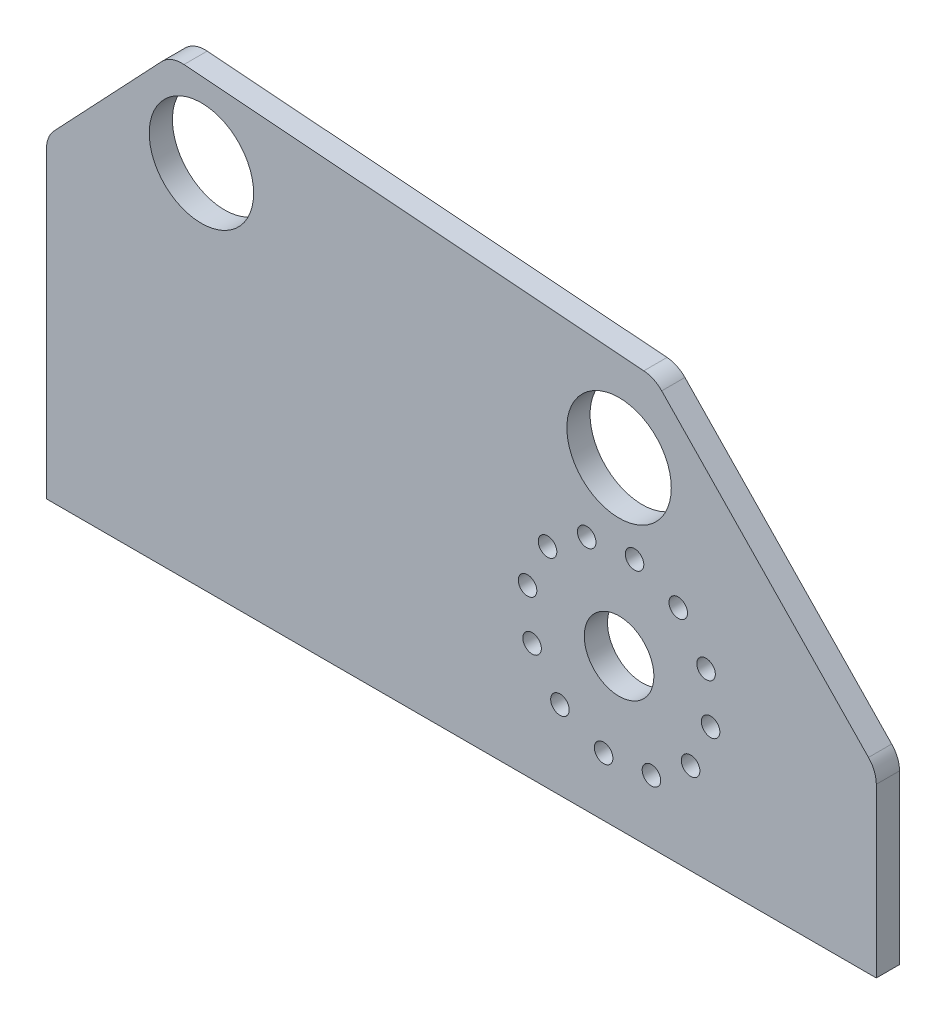
ISO-10303-21;
HEADER;
FILE_DESCRIPTION(('STEP AP214'),'2;1');
FILE_NAME('part.step','',(''),(''),'','','');
FILE_SCHEMA(('AUTOMOTIVE_DESIGN { 1 0 10303 214 1 1 1 1 }'));
ENDSEC;
DATA;
#1=APPLICATION_CONTEXT('core data for automotive mechanical design processes');
#2=APPLICATION_PROTOCOL_DEFINITION('international standard','automotive_design',2000,#1);
#3=PRODUCT_CONTEXT('',#1,'mechanical');
#4=PRODUCT('Part','Part','',(#3));
#5=PRODUCT_RELATED_PRODUCT_CATEGORY('part','',(#4));
#6=PRODUCT_DEFINITION_FORMATION('','',#4);
#7=PRODUCT_DEFINITION_CONTEXT('part definition',#1,'design');
#8=PRODUCT_DEFINITION('design','',#6,#7);
#9=PRODUCT_DEFINITION_SHAPE('','',#8);
#10=(LENGTH_UNIT() NAMED_UNIT(*) SI_UNIT(.MILLI.,.METRE.));
#11=(NAMED_UNIT(*) PLANE_ANGLE_UNIT() SI_UNIT($,.RADIAN.));
#12=(NAMED_UNIT(*) SI_UNIT($,.STERADIAN.) SOLID_ANGLE_UNIT());
#13=UNCERTAINTY_MEASURE_WITH_UNIT(LENGTH_MEASURE(1.E-05),#10,'distance_accuracy_value','');
#14=(GEOMETRIC_REPRESENTATION_CONTEXT(3) GLOBAL_UNCERTAINTY_ASSIGNED_CONTEXT((#13)) GLOBAL_UNIT_ASSIGNED_CONTEXT((#10,
#11,#12)) REPRESENTATION_CONTEXT('',''));
#15=CARTESIAN_POINT('',(0.,0.,0.));
#16=DIRECTION('',(0.,0.,1.));
#17=DIRECTION('',(1.,0.,0.));
#18=AXIS2_PLACEMENT_3D('',#15,#16,#17);
#19=CARTESIAN_POINT('',(-56.6052196507486,0.,3.175));
#20=DIRECTION('',(1.,0.,0.));
#21=DIRECTION('',(0.,0.,-1.));
#22=AXIS2_PLACEMENT_3D('',#19,#20,#21);
#23=PLANE('',#22);
#24=DIRECTION('',(0.,-1.,0.));
#25=VECTOR('',#24,1.);
#26=CARTESIAN_POINT('',(-56.6052196507486,0.,-3.175));
#27=LINE('',#26,#25);
#28=CARTESIAN_POINT('',(-56.6052196507486,200.39998243696,-3.175));
#29=VERTEX_POINT('',#28);
#30=CARTESIAN_POINT('',(-56.6052196507486,154.488890978673,-3.175));
#31=VERTEX_POINT('',#30);
#32=EDGE_CURVE('E220',#29,#31,#27,.T.);
#33=ORIENTED_EDGE('',*,*,#32,.F.);
#34=DIRECTION('',(0.,0.,-1.));
#35=VECTOR('',#34,1.);
#36=CARTESIAN_POINT('',(-56.6052196507486,200.39998243696,3.175));
#37=LINE('',#36,#35);
#38=CARTESIAN_POINT('',(-56.6052196507486,200.39998243696,3.175));
#39=VERTEX_POINT('',#38);
#40=EDGE_CURVE('E11',#39,#29,#37,.T.);
#41=ORIENTED_EDGE('',*,*,#40,.F.);
#42=DIRECTION('',(0.,-1.,0.));
#43=VECTOR('',#42,1.);
#44=CARTESIAN_POINT('',(-56.6052196507486,0.,3.175));
#45=LINE('',#44,#43);
#46=CARTESIAN_POINT('',(-56.6052196507486,154.488890978673,3.175));
#47=VERTEX_POINT('',#46);
#48=EDGE_CURVE('E304',#39,#47,#45,.T.);
#49=ORIENTED_EDGE('',*,*,#48,.T.);
#50=DIRECTION('',(0.,0.,-1.));
#51=VECTOR('',#50,1.);
#52=CARTESIAN_POINT('',(-56.6052196507486,154.488890978673,3.175));
#53=LINE('',#52,#51);
#54=EDGE_CURVE('E67',#47,#31,#53,.T.);
#55=ORIENTED_EDGE('',*,*,#54,.T.);
#56=EDGE_LOOP('',(#33,#41,#49,#55));
#57=FACE_BOUND('',#56,.T.);
#58=ADVANCED_FACE('F49',(#57),#23,.T.);
#59=CARTESIAN_POINT('',(-64.2252196507486,200.39998243696,3.175));
#60=DIRECTION('',(0.,0.,-1.));
#61=DIRECTION('',(-1.,0.,0.));
#62=AXIS2_PLACEMENT_3D('',#59,#60,#61);
#63=CYLINDRICAL_SURFACE('',#62,7.62000000000002);
#64=CARTESIAN_POINT('',(-64.2252196507486,200.39998243696,-3.175));
#65=DIRECTION('',(0.,0.,1.));
#66=DIRECTION('',(1.,0.,0.));
#67=AXIS2_PLACEMENT_3D('',#64,#65,#66);
#68=CIRCLE('',#67,7.62000000000002);
#69=CARTESIAN_POINT('',(-58.7443216503223,205.6937671992,-3.175));
#70=VERTEX_POINT('',#69);
#71=EDGE_CURVE('E223',#29,#70,#68,.T.);
#72=ORIENTED_EDGE('',*,*,#71,.T.);
#73=DIRECTION('',(0.,0.,-1.));
#74=VECTOR('',#73,1.);
#75=CARTESIAN_POINT('',(-58.7443216503223,205.6937671992,3.175));
#76=LINE('',#75,#74);
#77=CARTESIAN_POINT('',(-58.7443216503223,205.6937671992,3.175));
#78=VERTEX_POINT('',#77);
#79=EDGE_CURVE('E59',#78,#70,#76,.T.);
#80=ORIENTED_EDGE('',*,*,#79,.F.);
#81=CARTESIAN_POINT('',(-64.2252196507486,200.39998243696,3.175));
#82=DIRECTION('',(0.,0.,1.));
#83=DIRECTION('',(1.,0.,0.));
#84=AXIS2_PLACEMENT_3D('',#81,#82,#83);
#85=CIRCLE('',#84,7.62000000000002);
#86=EDGE_CURVE('E300',#39,#78,#85,.T.);
#87=ORIENTED_EDGE('',*,*,#86,.F.);
#88=ORIENTED_EDGE('',*,*,#40,.T.);
#89=EDGE_LOOP('',(#72,#80,#87,#88));
#90=FACE_BOUND('',#89,.T.);
#91=ADVANCED_FACE('F284',(#90),#63,.T.);
#92=CARTESIAN_POINT('',(72.3928618493464,69.9214305617787,3.175));
#93=DIRECTION('',(0.719277952811856,0.694722409742759,0.));
#94=DIRECTION('',(-0.694722409742759,0.719277952811856,0.));
#95=AXIS2_PLACEMENT_3D('',#92,#93,#94);
#96=PLANE('',#95);
#97=DIRECTION('',(0.694722409742759,-0.719277952811856,0.));
#98=VECTOR('',#97,1.);
#99=CARTESIAN_POINT('',(72.3928618493464,69.9214305617787,-3.175));
#100=LINE('',#99,#98);
#101=CARTESIAN_POINT('',(-115.329485400629,264.27898076229,-3.175));
#102=VERTEX_POINT('',#101);
#103=EDGE_CURVE('E227',#102,#70,#100,.T.);
#104=ORIENTED_EDGE('',*,*,#103,.F.);
#105=DIRECTION('',(0.,0.,-1.));
#106=VECTOR('',#105,1.);
#107=CARTESIAN_POINT('',(-115.329485400629,264.27898076229,3.175));
#108=LINE('',#107,#106);
#109=CARTESIAN_POINT('',(-115.329485400629,264.27898076229,3.175));
#110=VERTEX_POINT('',#109);
#111=EDGE_CURVE('E272',#110,#102,#108,.T.);
#112=ORIENTED_EDGE('',*,*,#111,.F.);
#113=DIRECTION('',(0.694722409742759,-0.719277952811856,0.));
#114=VECTOR('',#113,1.);
#115=CARTESIAN_POINT('',(72.3928618493464,69.9214305617787,3.175));
#116=LINE('',#115,#114);
#117=EDGE_CURVE('E281',#110,#78,#116,.T.);
#118=ORIENTED_EDGE('',*,*,#117,.T.);
#119=ORIENTED_EDGE('',*,*,#79,.T.);
#120=EDGE_LOOP('',(#104,#112,#118,#119));
#121=FACE_BOUND('',#120,.T.);
#122=ADVANCED_FACE('F279',(#121),#96,.T.);
#123=CARTESIAN_POINT('',(-120.810383401055,258.985196000051,3.175));
#124=DIRECTION('',(0.,0.,-1.));
#125=DIRECTION('',(-1.,0.,0.));
#126=AXIS2_PLACEMENT_3D('',#123,#124,#125);
#127=CYLINDRICAL_SURFACE('',#126,7.61999999999996);
#128=CARTESIAN_POINT('',(-120.810383401055,258.985196000051,-3.175));
#129=DIRECTION('',(0.,0.,1.));
#130=DIRECTION('',(1.,0.,0.));
#131=AXIS2_PLACEMENT_3D('',#128,#129,#130);
#132=CIRCLE('',#131,7.61999999999996);
#133=CARTESIAN_POINT('',(-120.226343784635,266.58278099309,-3.175));
#134=VERTEX_POINT('',#133);
#135=EDGE_CURVE('E231',#102,#134,#132,.T.);
#136=ORIENTED_EDGE('',*,*,#135,.T.);
#137=DIRECTION('',(0.,0.,-1.));
#138=VECTOR('',#137,1.);
#139=CARTESIAN_POINT('',(-120.226343784635,266.58278099309,3.175));
#140=LINE('',#139,#138);
#141=CARTESIAN_POINT('',(-120.226343784635,266.58278099309,3.175));
#142=VERTEX_POINT('',#141);
#143=EDGE_CURVE('E269',#142,#134,#140,.T.);
#144=ORIENTED_EDGE('',*,*,#143,.F.);
#145=CARTESIAN_POINT('',(-120.810383401055,258.985196000051,3.175));
#146=DIRECTION('',(0.,0.,1.));
#147=DIRECTION('',(1.,0.,0.));
#148=AXIS2_PLACEMENT_3D('',#145,#146,#147);
#149=CIRCLE('',#148,7.61999999999996);
#150=EDGE_CURVE('E295',#110,#142,#149,.T.);
#151=ORIENTED_EDGE('',*,*,#150,.F.);
#152=ORIENTED_EDGE('',*,*,#111,.T.);
#153=EDGE_LOOP('',(#136,#144,#151,#152));
#154=FACE_BOUND('',#153,.T.);
#155=ADVANCED_FACE('F292',(#154),#127,.T.);
#156=CARTESIAN_POINT('',(19.6660224801687,255.829010682081,3.175));
#157=DIRECTION('',(0.0766456189528719,0.99705839803661,0.));
#158=DIRECTION('',(-0.99705839803661,0.0766456189528719,0.));
#159=AXIS2_PLACEMENT_3D('',#156,#157,#158);
#160=PLANE('',#159);
#161=DIRECTION('',(0.99705839803661,-0.0766456189528719,0.));
#162=VECTOR('',#161,1.);
#163=CARTESIAN_POINT('',(19.6660224801687,255.829010682081,-3.175));
#164=LINE('',#163,#162);
#165=CARTESIAN_POINT('',(-246.064861075341,276.256207409085,-3.175));
#166=VERTEX_POINT('',#165);
#167=EDGE_CURVE('E235',#166,#134,#164,.T.);
#168=ORIENTED_EDGE('',*,*,#167,.F.);
#169=DIRECTION('',(0.,0.,-1.));
#170=VECTOR('',#169,1.);
#171=CARTESIAN_POINT('',(-246.064861075341,276.256207409085,3.175));
#172=LINE('',#171,#170);
#173=CARTESIAN_POINT('',(-246.064861075341,276.256207409085,3.175));
#174=VERTEX_POINT('',#173);
#175=EDGE_CURVE('E266',#174,#166,#172,.T.);
#176=ORIENTED_EDGE('',*,*,#175,.F.);
#177=DIRECTION('',(0.99705839803661,-0.0766456189528719,0.));
#178=VECTOR('',#177,1.);
#179=CARTESIAN_POINT('',(19.6660224801687,255.829010682081,3.175));
#180=LINE('',#179,#178);
#181=EDGE_CURVE('E298',#174,#142,#180,.T.);
#182=ORIENTED_EDGE('',*,*,#181,.T.);
#183=ORIENTED_EDGE('',*,*,#143,.T.);
#184=EDGE_LOOP('',(#168,#176,#182,#183));
#185=FACE_BOUND('',#184,.T.);
#186=ADVANCED_FACE('F599',(#185),#160,.T.);
#187=CARTESIAN_POINT('',(-246.648900691762,268.658622416047,3.175));
#188=DIRECTION('',(0.,0.,-1.));
#189=DIRECTION('',(-1.,0.,0.));
#190=AXIS2_PLACEMENT_3D('',#187,#188,#189);
#191=CYLINDRICAL_SURFACE('',#190,7.61999999999996);
#192=CARTESIAN_POINT('',(-246.648900691762,268.658622416047,-3.175));
#193=DIRECTION('',(0.,0.,1.));
#194=DIRECTION('',(1.,0.,0.));
#195=AXIS2_PLACEMENT_3D('',#192,#193,#194);
#196=CIRCLE('',#195,7.61999999999996);
#197=CARTESIAN_POINT('',(-252.186796021744,273.892752268674,-3.175));
#198=VERTEX_POINT('',#197);
#199=EDGE_CURVE('E239',#166,#198,#196,.T.);
#200=ORIENTED_EDGE('',*,*,#199,.T.);
#201=DIRECTION('',(0.,0.,-1.));
#202=VECTOR('',#201,1.);
#203=CARTESIAN_POINT('',(-252.186796021744,273.892752268674,3.175));
#204=LINE('',#203,#202);
#205=CARTESIAN_POINT('',(-252.186796021744,273.892752268674,3.175));
#206=VERTEX_POINT('',#205);
#207=EDGE_CURVE('E263',#206,#198,#204,.T.);
#208=ORIENTED_EDGE('',*,*,#207,.F.);
#209=CARTESIAN_POINT('',(-246.648900691762,268.658622416047,3.175));
#210=DIRECTION('',(0.,0.,1.));
#211=DIRECTION('',(1.,0.,0.));
#212=AXIS2_PLACEMENT_3D('',#209,#210,#211);
#213=CIRCLE('',#212,7.61999999999996);
#214=EDGE_CURVE('E310',#174,#206,#213,.T.);
#215=ORIENTED_EDGE('',*,*,#214,.F.);
#216=ORIENTED_EDGE('',*,*,#175,.T.);
#217=EDGE_LOOP('',(#200,#208,#215,#216));
#218=FACE_BOUND('',#217,.T.);
#219=ADVANCED_FACE('F591',(#218),#191,.T.);
#220=CARTESIAN_POINT('',(-269.928029914058,255.121896541613,3.175));
#221=DIRECTION('',(-0.72675791732049,0.686893681447124,0.));
#222=DIRECTION('',(-0.686893681447124,-0.72675791732049,0.));
#223=AXIS2_PLACEMENT_3D('',#220,#221,#222);
#224=PLANE('',#223);
#225=DIRECTION('',(0.686893681447124,0.72675791732049,0.));
#226=VECTOR('',#225,1.);
#227=CARTESIAN_POINT('',(-269.928029914058,255.121896541613,-3.175));
#228=LINE('',#227,#226);
#229=CARTESIAN_POINT('',(-281.613376670001,242.758384544203,-3.175));
#230=VERTEX_POINT('',#229);
#231=EDGE_CURVE('E243',#230,#198,#228,.T.);
#232=ORIENTED_EDGE('',*,*,#231,.F.);
#233=DIRECTION('',(0.,0.,-1.));
#234=VECTOR('',#233,1.);
#235=CARTESIAN_POINT('',(-281.613376670001,242.758384544203,3.175));
#236=LINE('',#235,#234);
#237=CARTESIAN_POINT('',(-281.613376670001,242.758384544203,3.175));
#238=VERTEX_POINT('',#237);
#239=EDGE_CURVE('E150',#238,#230,#236,.T.);
#240=ORIENTED_EDGE('',*,*,#239,.F.);
#241=DIRECTION('',(0.686893681447124,0.72675791732049,0.));
#242=VECTOR('',#241,1.);
#243=CARTESIAN_POINT('',(-269.928029914058,255.121896541613,3.175));
#244=LINE('',#243,#242);
#245=EDGE_CURVE('E138',#238,#206,#244,.T.);
#246=ORIENTED_EDGE('',*,*,#245,.T.);
#247=ORIENTED_EDGE('',*,*,#207,.T.);
#248=EDGE_LOOP('',(#232,#240,#246,#247));
#249=FACE_BOUND('',#248,.T.);
#250=ADVANCED_FACE('F315',(#249),#224,.T.);
#251=CARTESIAN_POINT('',(-276.075481340018,237.524254691576,3.175));
#252=DIRECTION('',(0.,0.,-1.));
#253=DIRECTION('',(-1.,0.,0.));
#254=AXIS2_PLACEMENT_3D('',#251,#252,#253);
#255=CYLINDRICAL_SURFACE('',#254,7.62);
#256=CARTESIAN_POINT('',(-276.075481340018,237.524254691576,-3.175));
#257=DIRECTION('',(0.,0.,1.));
#258=DIRECTION('',(1.,0.,0.));
#259=AXIS2_PLACEMENT_3D('',#256,#257,#258);
#260=CIRCLE('',#259,7.62);
#261=CARTESIAN_POINT('',(-283.695481340018,237.524254691576,-3.175));
#262=VERTEX_POINT('',#261);
#263=EDGE_CURVE('E146',#230,#262,#260,.T.);
#264=ORIENTED_EDGE('',*,*,#263,.T.);
#265=DIRECTION('',(0.,0.,-1.));
#266=VECTOR('',#265,1.);
#267=CARTESIAN_POINT('',(-283.695481340018,237.524254691576,3.175));
#268=LINE('',#267,#266);
#269=CARTESIAN_POINT('',(-283.695481340018,237.524254691576,3.175));
#270=VERTEX_POINT('',#269);
#271=EDGE_CURVE('E143',#270,#262,#268,.T.);
#272=ORIENTED_EDGE('',*,*,#271,.F.);
#273=CARTESIAN_POINT('',(-276.075481340018,237.524254691576,3.175));
#274=DIRECTION('',(0.,0.,1.));
#275=DIRECTION('',(1.,0.,0.));
#276=AXIS2_PLACEMENT_3D('',#273,#274,#275);
#277=CIRCLE('',#276,7.62);
#278=EDGE_CURVE('E130',#238,#270,#277,.T.);
#279=ORIENTED_EDGE('',*,*,#278,.F.);
#280=ORIENTED_EDGE('',*,*,#239,.T.);
#281=EDGE_LOOP('',(#264,#272,#279,#280));
#282=FACE_BOUND('',#281,.T.);
#283=ADVANCED_FACE('F144',(#282),#255,.T.);
#284=CARTESIAN_POINT('',(-283.695481340018,0.,3.175));
#285=DIRECTION('',(-1.,0.,0.));
#286=DIRECTION('',(0.,0.,1.));
#287=AXIS2_PLACEMENT_3D('',#284,#285,#286);
#288=PLANE('',#287);
#289=DIRECTION('',(0.,1.,0.));
#290=VECTOR('',#289,1.);
#291=CARTESIAN_POINT('',(-283.695481340018,0.,-3.175));
#292=LINE('',#291,#290);
#293=CARTESIAN_POINT('',(-283.695481340018,154.488890978673,-3.175));
#294=VERTEX_POINT('',#293);
#295=EDGE_CURVE('E249',#294,#262,#292,.T.);
#296=ORIENTED_EDGE('',*,*,#295,.F.);
#297=DIRECTION('',(0.,0.,-1.));
#298=VECTOR('',#297,1.);
#299=CARTESIAN_POINT('',(-283.695481340018,154.488890978673,3.175));
#300=LINE('',#299,#298);
#301=CARTESIAN_POINT('',(-283.695481340018,154.488890978673,3.175));
#302=VERTEX_POINT('',#301);
#303=EDGE_CURVE('E98',#302,#294,#300,.T.);
#304=ORIENTED_EDGE('',*,*,#303,.F.);
#305=DIRECTION('',(0.,1.,0.));
#306=VECTOR('',#305,1.);
#307=CARTESIAN_POINT('',(-283.695481340018,0.,3.175));
#308=LINE('',#307,#306);
#309=EDGE_CURVE('E136',#302,#270,#308,.T.);
#310=ORIENTED_EDGE('',*,*,#309,.T.);
#311=ORIENTED_EDGE('',*,*,#271,.T.);
#312=EDGE_LOOP('',(#296,#304,#310,#311));
#313=FACE_BOUND('',#312,.T.);
#314=ADVANCED_FACE('F152',(#313),#288,.T.);
#315=CARTESIAN_POINT('',(-127.,242.57,3.175));
#316=DIRECTION('',(0.,0.,-1.));
#317=DIRECTION('',(-1.,0.,0.));
#318=AXIS2_PLACEMENT_3D('',#315,#316,#317);
#319=CYLINDRICAL_SURFACE('',#318,14.2875);
#320=CARTESIAN_POINT('',(-127.,242.57,3.175));
#321=DIRECTION('',(0.,0.,1.));
#322=DIRECTION('',(1.,0.,0.));
#323=AXIS2_PLACEMENT_3D('',#320,#321,#322);
#324=CIRCLE('',#323,14.2875);
#325=CARTESIAN_POINT('',(-112.7125,242.57,3.175));
#326=VERTEX_POINT('',#325);
#327=EDGE_CURVE('E736',#326,#326,#324,.T.);
#328=ORIENTED_EDGE('',*,*,#327,.T.);
#329=EDGE_LOOP('',(#328));
#330=FACE_BOUND('',#329,.T.);
#331=CARTESIAN_POINT('',(-127.,242.57,-3.175));
#332=DIRECTION('',(0.,0.,1.));
#333=DIRECTION('',(1.,0.,0.));
#334=AXIS2_PLACEMENT_3D('',#331,#332,#333);
#335=CIRCLE('',#334,14.2875);
#336=CARTESIAN_POINT('',(-112.7125,242.57,-3.175));
#337=VERTEX_POINT('',#336);
#338=EDGE_CURVE('E216',#337,#337,#335,.T.);
#339=ORIENTED_EDGE('',*,*,#338,.F.);
#340=EDGE_LOOP('',(#339));
#341=FACE_BOUND('',#340,.T.);
#342=ADVANCED_FACE('F338',(#330,#341),#319,.F.);
#343=CARTESIAN_POINT('',(-241.3,255.27,3.175));
#344=DIRECTION('',(0.,0.,-1.));
#345=DIRECTION('',(-1.,0.,0.));
#346=AXIS2_PLACEMENT_3D('',#343,#344,#345);
#347=CYLINDRICAL_SURFACE('',#346,14.2875);
#348=CARTESIAN_POINT('',(-241.3,255.27,3.175));
#349=DIRECTION('',(0.,0.,1.));
#350=DIRECTION('',(1.,0.,0.));
#351=AXIS2_PLACEMENT_3D('',#348,#349,#350);
#352=CIRCLE('',#351,14.2875);
#353=CARTESIAN_POINT('',(-227.0125,255.27,3.175));
#354=VERTEX_POINT('',#353);
#355=EDGE_CURVE('E732',#354,#354,#352,.T.);
#356=ORIENTED_EDGE('',*,*,#355,.T.);
#357=EDGE_LOOP('',(#356));
#358=FACE_BOUND('',#357,.T.);
#359=CARTESIAN_POINT('',(-241.3,255.27,-3.175));
#360=DIRECTION('',(0.,0.,1.));
#361=DIRECTION('',(1.,0.,0.));
#362=AXIS2_PLACEMENT_3D('',#359,#360,#361);
#363=CIRCLE('',#362,14.2875);
#364=CARTESIAN_POINT('',(-227.0125,255.27,-3.175));
#365=VERTEX_POINT('',#364);
#366=EDGE_CURVE('E212',#365,#365,#363,.T.);
#367=ORIENTED_EDGE('',*,*,#366,.F.);
#368=EDGE_LOOP('',(#367));
#369=FACE_BOUND('',#368,.T.);
#370=ADVANCED_FACE('F341',(#358,#369),#347,.F.);
#371=CARTESIAN_POINT('',(-135.860813465871,219.384327016806,3.175));
#372=DIRECTION('',(0.,0.,-1.));
#373=DIRECTION('',(-1.,0.,0.));
#374=AXIS2_PLACEMENT_3D('',#371,#372,#373);
#375=CYLINDRICAL_SURFACE('',#374,2.54000000000004);
#376=CARTESIAN_POINT('',(-135.860813465871,219.384327016806,3.175));
#377=DIRECTION('',(0.,0.,1.));
#378=DIRECTION('',(1.,0.,0.));
#379=AXIS2_PLACEMENT_3D('',#376,#377,#378);
#380=CIRCLE('',#379,2.54000000000004);
#381=CARTESIAN_POINT('',(-133.320813465871,219.384327016806,3.175));
#382=VERTEX_POINT('',#381);
#383=EDGE_CURVE('E728',#382,#382,#380,.T.);
#384=ORIENTED_EDGE('',*,*,#383,.T.);
#385=EDGE_LOOP('',(#384));
#386=FACE_BOUND('',#385,.T.);
#387=CARTESIAN_POINT('',(-135.860813465871,219.384327016806,-3.175));
#388=DIRECTION('',(0.,0.,1.));
#389=DIRECTION('',(1.,0.,0.));
#390=AXIS2_PLACEMENT_3D('',#387,#388,#389);
#391=CIRCLE('',#390,2.54000000000004);
#392=CARTESIAN_POINT('',(-133.320813465871,219.384327016806,-3.175));
#393=VERTEX_POINT('',#392);
#394=EDGE_CURVE('E208',#393,#393,#391,.T.);
#395=ORIENTED_EDGE('',*,*,#394,.F.);
#396=EDGE_LOOP('',(#395));
#397=FACE_BOUND('',#396,.T.);
#398=ADVANCED_FACE('F345',(#386,#397),#375,.F.);
#399=CARTESIAN_POINT('',(-146.575853068043,211.764745183611,3.175));
#400=DIRECTION('',(0.,0.,-1.));
#401=DIRECTION('',(-1.,0.,0.));
#402=AXIS2_PLACEMENT_3D('',#399,#400,#401);
#403=CYLINDRICAL_SURFACE('',#402,2.54000000000004);
#404=CARTESIAN_POINT('',(-146.575853068043,211.764745183611,3.175));
#405=DIRECTION('',(0.,0.,1.));
#406=DIRECTION('',(1.,0.,0.));
#407=AXIS2_PLACEMENT_3D('',#404,#405,#406);
#408=CIRCLE('',#407,2.54000000000004);
#409=CARTESIAN_POINT('',(-144.035853068043,211.764745183611,3.175));
#410=VERTEX_POINT('',#409);
#411=EDGE_CURVE('E724',#410,#410,#408,.T.);
#412=ORIENTED_EDGE('',*,*,#411,.T.);
#413=EDGE_LOOP('',(#412));
#414=FACE_BOUND('',#413,.T.);
#415=CARTESIAN_POINT('',(-146.575853068043,211.764745183611,-3.175));
#416=DIRECTION('',(0.,0.,1.));
#417=DIRECTION('',(1.,0.,0.));
#418=AXIS2_PLACEMENT_3D('',#415,#416,#417);
#419=CIRCLE('',#418,2.54000000000004);
#420=CARTESIAN_POINT('',(-144.035853068043,211.764745183611,-3.175));
#421=VERTEX_POINT('',#420);
#422=EDGE_CURVE('E204',#421,#421,#419,.T.);
#423=ORIENTED_EDGE('',*,*,#422,.F.);
#424=EDGE_LOOP('',(#423));
#425=FACE_BOUND('',#424,.T.);
#426=ADVANCED_FACE('F349',(#414,#425),#403,.F.);
#427=CARTESIAN_POINT('',(-152.045558649482,199.808473948763,3.175));
#428=DIRECTION('',(0.,0.,-1.));
#429=DIRECTION('',(-1.,0.,0.));
#430=AXIS2_PLACEMENT_3D('',#427,#428,#429);
#431=CYLINDRICAL_SURFACE('',#430,2.54000000000001);
#432=CARTESIAN_POINT('',(-152.045558649482,199.808473948763,3.175));
#433=DIRECTION('',(0.,0.,1.));
#434=DIRECTION('',(1.,0.,0.));
#435=AXIS2_PLACEMENT_3D('',#432,#433,#434);
#436=CIRCLE('',#435,2.54000000000001);
#437=CARTESIAN_POINT('',(-149.505558649482,199.808473948763,3.175));
#438=VERTEX_POINT('',#437);
#439=EDGE_CURVE('E720',#438,#438,#436,.T.);
#440=ORIENTED_EDGE('',*,*,#439,.T.);
#441=EDGE_LOOP('',(#440));
#442=FACE_BOUND('',#441,.T.);
#443=CARTESIAN_POINT('',(-152.045558649482,199.808473948763,-3.175));
#444=DIRECTION('',(0.,0.,1.));
#445=DIRECTION('',(1.,0.,0.));
#446=AXIS2_PLACEMENT_3D('',#443,#444,#445);
#447=CIRCLE('',#446,2.54000000000001);
#448=CARTESIAN_POINT('',(-149.505558649482,199.808473948763,-3.175));
#449=VERTEX_POINT('',#448);
#450=EDGE_CURVE('E200',#449,#449,#447,.T.);
#451=ORIENTED_EDGE('',*,*,#450,.F.);
#452=EDGE_LOOP('',(#451));
#453=FACE_BOUND('',#452,.T.);
#454=ADVANCED_FACE('F353',(#442,#453),#431,.F.);
#455=CARTESIAN_POINT('',(-150.804327016806,186.719186534129,3.175));
#456=DIRECTION('',(0.,0.,-1.));
#457=DIRECTION('',(-1.,0.,0.));
#458=AXIS2_PLACEMENT_3D('',#455,#456,#457);
#459=CYLINDRICAL_SURFACE('',#458,2.54000000000001);
#460=CARTESIAN_POINT('',(-150.804327016806,186.719186534129,3.175));
#461=DIRECTION('',(0.,0.,1.));
#462=DIRECTION('',(1.,0.,0.));
#463=AXIS2_PLACEMENT_3D('',#460,#461,#462);
#464=CIRCLE('',#463,2.54000000000001);
#465=CARTESIAN_POINT('',(-148.264327016806,186.719186534129,3.175));
#466=VERTEX_POINT('',#465);
#467=EDGE_CURVE('E716',#466,#466,#464,.T.);
#468=ORIENTED_EDGE('',*,*,#467,.T.);
#469=EDGE_LOOP('',(#468));
#470=FACE_BOUND('',#469,.T.);
#471=CARTESIAN_POINT('',(-150.804327016806,186.719186534129,-3.175));
#472=DIRECTION('',(0.,0.,1.));
#473=DIRECTION('',(1.,0.,0.));
#474=AXIS2_PLACEMENT_3D('',#471,#472,#473);
#475=CIRCLE('',#474,2.54000000000001);
#476=CARTESIAN_POINT('',(-148.264327016806,186.719186534129,-3.175));
#477=VERTEX_POINT('',#476);
#478=EDGE_CURVE('E196',#477,#477,#475,.T.);
#479=ORIENTED_EDGE('',*,*,#478,.F.);
#480=EDGE_LOOP('',(#479));
#481=FACE_BOUND('',#480,.T.);
#482=ADVANCED_FACE('F357',(#470,#481),#459,.F.);
#483=CARTESIAN_POINT('',(-143.184745183611,176.004146931957,3.175));
#484=DIRECTION('',(0.,0.,-1.));
#485=DIRECTION('',(-1.,0.,0.));
#486=AXIS2_PLACEMENT_3D('',#483,#484,#485);
#487=CYLINDRICAL_SURFACE('',#486,2.53999999999998);
#488=CARTESIAN_POINT('',(-143.184745183611,176.004146931957,3.175));
#489=DIRECTION('',(0.,0.,1.));
#490=DIRECTION('',(1.,0.,0.));
#491=AXIS2_PLACEMENT_3D('',#488,#489,#490);
#492=CIRCLE('',#491,2.53999999999998);
#493=CARTESIAN_POINT('',(-140.644745183611,176.004146931957,3.175));
#494=VERTEX_POINT('',#493);
#495=EDGE_CURVE('E712',#494,#494,#492,.T.);
#496=ORIENTED_EDGE('',*,*,#495,.T.);
#497=EDGE_LOOP('',(#496));
#498=FACE_BOUND('',#497,.T.);
#499=CARTESIAN_POINT('',(-143.184745183611,176.004146931957,-3.175));
#500=DIRECTION('',(0.,0.,1.));
#501=DIRECTION('',(1.,0.,0.));
#502=AXIS2_PLACEMENT_3D('',#499,#500,#501);
#503=CIRCLE('',#502,2.53999999999998);
#504=CARTESIAN_POINT('',(-140.644745183611,176.004146931957,-3.175));
#505=VERTEX_POINT('',#504);
#506=EDGE_CURVE('E192',#505,#505,#503,.T.);
#507=ORIENTED_EDGE('',*,*,#506,.F.);
#508=EDGE_LOOP('',(#507));
#509=FACE_BOUND('',#508,.T.);
#510=ADVANCED_FACE('F361',(#498,#509),#487,.F.);
#511=CARTESIAN_POINT('',(-131.228473948763,170.534441350518,3.175));
#512=DIRECTION('',(0.,0.,-1.));
#513=DIRECTION('',(-1.,0.,0.));
#514=AXIS2_PLACEMENT_3D('',#511,#512,#513);
#515=CYLINDRICAL_SURFACE('',#514,2.54000000000004);
#516=CARTESIAN_POINT('',(-131.228473948763,170.534441350518,3.175));
#517=DIRECTION('',(0.,0.,1.));
#518=DIRECTION('',(1.,0.,0.));
#519=AXIS2_PLACEMENT_3D('',#516,#517,#518);
#520=CIRCLE('',#519,2.54000000000004);
#521=CARTESIAN_POINT('',(-128.688473948763,170.534441350518,3.175));
#522=VERTEX_POINT('',#521);
#523=EDGE_CURVE('E708',#522,#522,#520,.T.);
#524=ORIENTED_EDGE('',*,*,#523,.T.);
#525=EDGE_LOOP('',(#524));
#526=FACE_BOUND('',#525,.T.);
#527=CARTESIAN_POINT('',(-131.228473948763,170.534441350518,-3.175));
#528=DIRECTION('',(0.,0.,1.));
#529=DIRECTION('',(1.,0.,0.));
#530=AXIS2_PLACEMENT_3D('',#527,#528,#529);
#531=CIRCLE('',#530,2.54000000000004);
#532=CARTESIAN_POINT('',(-128.688473948763,170.534441350518,-3.175));
#533=VERTEX_POINT('',#532);
#534=EDGE_CURVE('E188',#533,#533,#531,.T.);
#535=ORIENTED_EDGE('',*,*,#534,.F.);
#536=EDGE_LOOP('',(#535));
#537=FACE_BOUND('',#536,.T.);
#538=ADVANCED_FACE('F365',(#526,#537),#515,.F.);
#539=CARTESIAN_POINT('',(-118.139186534129,171.775672983194,3.175));
#540=DIRECTION('',(0.,0.,-1.));
#541=DIRECTION('',(-1.,0.,0.));
#542=AXIS2_PLACEMENT_3D('',#539,#540,#541);
#543=CYLINDRICAL_SURFACE('',#542,2.54000000000001);
#544=CARTESIAN_POINT('',(-118.139186534129,171.775672983194,3.175));
#545=DIRECTION('',(0.,0.,1.));
#546=DIRECTION('',(1.,0.,0.));
#547=AXIS2_PLACEMENT_3D('',#544,#545,#546);
#548=CIRCLE('',#547,2.54000000000001);
#549=CARTESIAN_POINT('',(-115.599186534129,171.775672983194,3.175));
#550=VERTEX_POINT('',#549);
#551=EDGE_CURVE('E704',#550,#550,#548,.T.);
#552=ORIENTED_EDGE('',*,*,#551,.T.);
#553=EDGE_LOOP('',(#552));
#554=FACE_BOUND('',#553,.T.);
#555=CARTESIAN_POINT('',(-118.139186534129,171.775672983194,-3.175));
#556=DIRECTION('',(0.,0.,1.));
#557=DIRECTION('',(1.,0.,0.));
#558=AXIS2_PLACEMENT_3D('',#555,#556,#557);
#559=CIRCLE('',#558,2.54000000000001);
#560=CARTESIAN_POINT('',(-115.599186534129,171.775672983194,-3.175));
#561=VERTEX_POINT('',#560);
#562=EDGE_CURVE('E184',#561,#561,#559,.T.);
#563=ORIENTED_EDGE('',*,*,#562,.F.);
#564=EDGE_LOOP('',(#563));
#565=FACE_BOUND('',#564,.T.);
#566=ADVANCED_FACE('F369',(#554,#565),#543,.F.);
#567=CARTESIAN_POINT('',(-107.424146931957,179.395254816389,3.175));
#568=DIRECTION('',(0.,0.,-1.));
#569=DIRECTION('',(-1.,0.,0.));
#570=AXIS2_PLACEMENT_3D('',#567,#568,#569);
#571=CYLINDRICAL_SURFACE('',#570,2.53999999999998);
#572=CARTESIAN_POINT('',(-107.424146931957,179.395254816389,3.175));
#573=DIRECTION('',(0.,0.,1.));
#574=DIRECTION('',(1.,0.,0.));
#575=AXIS2_PLACEMENT_3D('',#572,#573,#574);
#576=CIRCLE('',#575,2.53999999999998);
#577=CARTESIAN_POINT('',(-104.884146931957,179.395254816389,3.175));
#578=VERTEX_POINT('',#577);
#579=EDGE_CURVE('E700',#578,#578,#576,.T.);
#580=ORIENTED_EDGE('',*,*,#579,.T.);
#581=EDGE_LOOP('',(#580));
#582=FACE_BOUND('',#581,.T.);
#583=CARTESIAN_POINT('',(-107.424146931957,179.395254816389,-3.175));
#584=DIRECTION('',(0.,0.,1.));
#585=DIRECTION('',(1.,0.,0.));
#586=AXIS2_PLACEMENT_3D('',#583,#584,#585);
#587=CIRCLE('',#586,2.53999999999998);
#588=CARTESIAN_POINT('',(-104.884146931957,179.395254816389,-3.175));
#589=VERTEX_POINT('',#588);
#590=EDGE_CURVE('E180',#589,#589,#587,.T.);
#591=ORIENTED_EDGE('',*,*,#590,.F.);
#592=EDGE_LOOP('',(#591));
#593=FACE_BOUND('',#592,.T.);
#594=ADVANCED_FACE('F373',(#582,#593),#571,.F.);
#595=CARTESIAN_POINT('',(-101.954441350518,191.351526051237,3.175));
#596=DIRECTION('',(0.,0.,-1.));
#597=DIRECTION('',(-1.,0.,0.));
#598=AXIS2_PLACEMENT_3D('',#595,#596,#597);
#599=CYLINDRICAL_SURFACE('',#598,2.54000000000001);
#600=CARTESIAN_POINT('',(-101.954441350518,191.351526051237,3.175));
#601=DIRECTION('',(0.,0.,1.));
#602=DIRECTION('',(1.,0.,0.));
#603=AXIS2_PLACEMENT_3D('',#600,#601,#602);
#604=CIRCLE('',#603,2.54000000000001);
#605=CARTESIAN_POINT('',(-99.4144413505182,191.351526051237,3.175));
#606=VERTEX_POINT('',#605);
#607=EDGE_CURVE('E696',#606,#606,#604,.T.);
#608=ORIENTED_EDGE('',*,*,#607,.T.);
#609=EDGE_LOOP('',(#608));
#610=FACE_BOUND('',#609,.T.);
#611=CARTESIAN_POINT('',(-101.954441350518,191.351526051237,-3.175));
#612=DIRECTION('',(0.,0.,1.));
#613=DIRECTION('',(1.,0.,0.));
#614=AXIS2_PLACEMENT_3D('',#611,#612,#613);
#615=CIRCLE('',#614,2.54000000000001);
#616=CARTESIAN_POINT('',(-99.4144413505182,191.351526051237,-3.175));
#617=VERTEX_POINT('',#616);
#618=EDGE_CURVE('E176',#617,#617,#615,.T.);
#619=ORIENTED_EDGE('',*,*,#618,.F.);
#620=EDGE_LOOP('',(#619));
#621=FACE_BOUND('',#620,.T.);
#622=ADVANCED_FACE('F377',(#610,#621),#599,.F.);
#623=CARTESIAN_POINT('',(-103.195672983194,204.440813465871,3.175));
#624=DIRECTION('',(0.,0.,-1.));
#625=DIRECTION('',(-1.,0.,0.));
#626=AXIS2_PLACEMENT_3D('',#623,#624,#625);
#627=CYLINDRICAL_SURFACE('',#626,2.54000000000001);
#628=CARTESIAN_POINT('',(-103.195672983194,204.440813465871,3.175));
#629=DIRECTION('',(0.,0.,1.));
#630=DIRECTION('',(1.,0.,0.));
#631=AXIS2_PLACEMENT_3D('',#628,#629,#630);
#632=CIRCLE('',#631,2.54000000000001);
#633=CARTESIAN_POINT('',(-100.655672983194,204.440813465871,3.175));
#634=VERTEX_POINT('',#633);
#635=EDGE_CURVE('E688',#634,#634,#632,.T.);
#636=ORIENTED_EDGE('',*,*,#635,.T.);
#637=EDGE_LOOP('',(#636));
#638=FACE_BOUND('',#637,.T.);
#639=CARTESIAN_POINT('',(-103.195672983194,204.440813465871,-3.175));
#640=DIRECTION('',(0.,0.,1.));
#641=DIRECTION('',(1.,0.,0.));
#642=AXIS2_PLACEMENT_3D('',#639,#640,#641);
#643=CIRCLE('',#642,2.54000000000001);
#644=CARTESIAN_POINT('',(-100.655672983194,204.440813465871,-3.175));
#645=VERTEX_POINT('',#644);
#646=EDGE_CURVE('E172',#645,#645,#643,.T.);
#647=ORIENTED_EDGE('',*,*,#646,.F.);
#648=EDGE_LOOP('',(#647));
#649=FACE_BOUND('',#648,.T.);
#650=ADVANCED_FACE('F381',(#638,#649),#627,.F.);
#651=CARTESIAN_POINT('',(-110.815254816389,215.155853068043,3.175));
#652=DIRECTION('',(0.,0.,-1.));
#653=DIRECTION('',(-1.,0.,0.));
#654=AXIS2_PLACEMENT_3D('',#651,#652,#653);
#655=CYLINDRICAL_SURFACE('',#654,2.54000000000004);
#656=CARTESIAN_POINT('',(-110.815254816389,215.155853068043,3.175));
#657=DIRECTION('',(0.,0.,1.));
#658=DIRECTION('',(1.,0.,0.));
#659=AXIS2_PLACEMENT_3D('',#656,#657,#658);
#660=CIRCLE('',#659,2.54000000000004);
#661=CARTESIAN_POINT('',(-108.275254816389,215.155853068043,3.175));
#662=VERTEX_POINT('',#661);
#663=EDGE_CURVE('E683',#662,#662,#660,.T.);
#664=ORIENTED_EDGE('',*,*,#663,.T.);
#665=EDGE_LOOP('',(#664));
#666=FACE_BOUND('',#665,.T.);
#667=CARTESIAN_POINT('',(-110.815254816389,215.155853068043,-3.175));
#668=DIRECTION('',(0.,0.,1.));
#669=DIRECTION('',(1.,0.,0.));
#670=AXIS2_PLACEMENT_3D('',#667,#668,#669);
#671=CIRCLE('',#670,2.54000000000004);
#672=CARTESIAN_POINT('',(-108.275254816389,215.155853068043,-3.175));
#673=VERTEX_POINT('',#672);
#674=EDGE_CURVE('E168',#673,#673,#671,.T.);
#675=ORIENTED_EDGE('',*,*,#674,.F.);
#676=EDGE_LOOP('',(#675));
#677=FACE_BOUND('',#676,.T.);
#678=ADVANCED_FACE('F385',(#666,#677),#655,.F.);
#679=CARTESIAN_POINT('',(-122.771526051237,220.625558649482,3.175));
#680=DIRECTION('',(0.,0.,-1.));
#681=DIRECTION('',(-1.,0.,0.));
#682=AXIS2_PLACEMENT_3D('',#679,#680,#681);
#683=CYLINDRICAL_SURFACE('',#682,2.54000000000004);
#684=CARTESIAN_POINT('',(-122.771526051237,220.625558649482,3.175));
#685=DIRECTION('',(0.,0.,1.));
#686=DIRECTION('',(1.,0.,0.));
#687=AXIS2_PLACEMENT_3D('',#684,#685,#686);
#688=CIRCLE('',#687,2.54000000000004);
#689=CARTESIAN_POINT('',(-120.231526051237,220.625558649482,3.175));
#690=VERTEX_POINT('',#689);
#691=EDGE_CURVE('E396',#690,#690,#688,.T.);
#692=ORIENTED_EDGE('',*,*,#691,.T.);
#693=EDGE_LOOP('',(#692));
#694=FACE_BOUND('',#693,.T.);
#695=CARTESIAN_POINT('',(-122.771526051237,220.625558649482,-3.175));
#696=DIRECTION('',(0.,0.,1.));
#697=DIRECTION('',(1.,0.,0.));
#698=AXIS2_PLACEMENT_3D('',#695,#696,#697);
#699=CIRCLE('',#698,2.54000000000004);
#700=CARTESIAN_POINT('',(-120.231526051237,220.625558649482,-3.175));
#701=VERTEX_POINT('',#700);
#702=EDGE_CURVE('E164',#701,#701,#699,.T.);
#703=ORIENTED_EDGE('',*,*,#702,.F.);
#704=EDGE_LOOP('',(#703));
#705=FACE_BOUND('',#704,.T.);
#706=ADVANCED_FACE('F326',(#694,#705),#683,.F.);
#707=CARTESIAN_POINT('',(-127.,195.58,3.175));
#708=DIRECTION('',(0.,0.,-1.));
#709=DIRECTION('',(-1.,0.,0.));
#710=AXIS2_PLACEMENT_3D('',#707,#708,#709);
#711=CYLINDRICAL_SURFACE('',#710,9.52499999999999);
#712=CARTESIAN_POINT('',(-127.,195.58,3.175));
#713=DIRECTION('',(0.,0.,1.));
#714=DIRECTION('',(1.,0.,0.));
#715=AXIS2_PLACEMENT_3D('',#712,#713,#714);
#716=CIRCLE('',#715,9.52499999999999);
#717=CARTESIAN_POINT('',(-117.475,195.58,3.175));
#718=VERTEX_POINT('',#717);
#719=EDGE_CURVE('E256',#718,#718,#716,.T.);
#720=ORIENTED_EDGE('',*,*,#719,.T.);
#721=EDGE_LOOP('',(#720));
#722=FACE_BOUND('',#721,.T.);
#723=CARTESIAN_POINT('',(-127.,195.58,-3.175));
#724=DIRECTION('',(0.,0.,1.));
#725=DIRECTION('',(1.,0.,0.));
#726=AXIS2_PLACEMENT_3D('',#723,#724,#725);
#727=CIRCLE('',#726,9.52499999999999);
#728=CARTESIAN_POINT('',(-117.475,195.58,-3.175));
#729=VERTEX_POINT('',#728);
#730=EDGE_CURVE('E160',#729,#729,#727,.T.);
#731=ORIENTED_EDGE('',*,*,#730,.F.);
#732=EDGE_LOOP('',(#731));
#733=FACE_BOUND('',#732,.T.);
#734=ADVANCED_FACE('F51',(#722,#733),#711,.F.);
#735=CARTESIAN_POINT('',(0.,154.488890978673,3.175));
#736=DIRECTION('',(0.,-1.,0.));
#737=DIRECTION('',(1.,0.,0.));
#738=AXIS2_PLACEMENT_3D('',#735,#736,#737);
#739=PLANE('',#738);
#740=DIRECTION('',(-1.,0.,0.));
#741=VECTOR('',#740,1.);
#742=CARTESIAN_POINT('',(0.,154.488890978673,-3.175));
#743=LINE('',#742,#741);
#744=EDGE_CURVE('E252',#31,#294,#743,.T.);
#745=ORIENTED_EDGE('',*,*,#744,.F.);
#746=ORIENTED_EDGE('',*,*,#54,.F.);
#747=DIRECTION('',(-1.,0.,0.));
#748=VECTOR('',#747,1.);
#749=CARTESIAN_POINT('',(0.,154.488890978673,3.175));
#750=LINE('',#749,#748);
#751=EDGE_CURVE('E154',#47,#302,#750,.T.);
#752=ORIENTED_EDGE('',*,*,#751,.T.);
#753=ORIENTED_EDGE('',*,*,#303,.T.);
#754=EDGE_LOOP('',(#745,#746,#752,#753));
#755=FACE_BOUND('',#754,.T.);
#756=ADVANCED_FACE('F317',(#755),#739,.T.);
#757=CARTESIAN_POINT('',(0.,0.,3.175));
#758=DIRECTION('',(0.,0.,1.));
#759=DIRECTION('',(1.,0.,0.));
#760=AXIS2_PLACEMENT_3D('',#757,#758,#759);
#761=PLANE('',#760);
#762=ORIENTED_EDGE('',*,*,#719,.F.);
#763=EDGE_LOOP('',(#762));
#764=FACE_BOUND('',#763,.T.);
#765=ORIENTED_EDGE('',*,*,#691,.F.);
#766=EDGE_LOOP('',(#765));
#767=FACE_BOUND('',#766,.T.);
#768=ORIENTED_EDGE('',*,*,#663,.F.);
#769=EDGE_LOOP('',(#768));
#770=FACE_BOUND('',#769,.T.);
#771=ORIENTED_EDGE('',*,*,#635,.F.);
#772=EDGE_LOOP('',(#771));
#773=FACE_BOUND('',#772,.T.);
#774=ORIENTED_EDGE('',*,*,#607,.F.);
#775=EDGE_LOOP('',(#774));
#776=FACE_BOUND('',#775,.T.);
#777=ORIENTED_EDGE('',*,*,#579,.F.);
#778=EDGE_LOOP('',(#777));
#779=FACE_BOUND('',#778,.T.);
#780=ORIENTED_EDGE('',*,*,#551,.F.);
#781=EDGE_LOOP('',(#780));
#782=FACE_BOUND('',#781,.T.);
#783=ORIENTED_EDGE('',*,*,#523,.F.);
#784=EDGE_LOOP('',(#783));
#785=FACE_BOUND('',#784,.T.);
#786=ORIENTED_EDGE('',*,*,#495,.F.);
#787=EDGE_LOOP('',(#786));
#788=FACE_BOUND('',#787,.T.);
#789=ORIENTED_EDGE('',*,*,#467,.F.);
#790=EDGE_LOOP('',(#789));
#791=FACE_BOUND('',#790,.T.);
#792=ORIENTED_EDGE('',*,*,#439,.F.);
#793=EDGE_LOOP('',(#792));
#794=FACE_BOUND('',#793,.T.);
#795=ORIENTED_EDGE('',*,*,#411,.F.);
#796=EDGE_LOOP('',(#795));
#797=FACE_BOUND('',#796,.T.);
#798=ORIENTED_EDGE('',*,*,#383,.F.);
#799=EDGE_LOOP('',(#798));
#800=FACE_BOUND('',#799,.T.);
#801=ORIENTED_EDGE('',*,*,#355,.F.);
#802=EDGE_LOOP('',(#801));
#803=FACE_BOUND('',#802,.T.);
#804=ORIENTED_EDGE('',*,*,#327,.F.);
#805=EDGE_LOOP('',(#804));
#806=FACE_BOUND('',#805,.T.);
#807=ORIENTED_EDGE('',*,*,#48,.F.);
#808=ORIENTED_EDGE('',*,*,#86,.T.);
#809=ORIENTED_EDGE('',*,*,#117,.F.);
#810=ORIENTED_EDGE('',*,*,#150,.T.);
#811=ORIENTED_EDGE('',*,*,#181,.F.);
#812=ORIENTED_EDGE('',*,*,#214,.T.);
#813=ORIENTED_EDGE('',*,*,#245,.F.);
#814=ORIENTED_EDGE('',*,*,#278,.T.);
#815=ORIENTED_EDGE('',*,*,#309,.F.);
#816=ORIENTED_EDGE('',*,*,#751,.F.);
#817=EDGE_LOOP('',(#807,#808,#809,#810,#811,#812,#813,#814,#815,#816));
#818=FACE_BOUND('',#817,.T.);
#819=ADVANCED_FACE('F133',(#764,#767,#770,#773,#776,#779,#782,#785,#788,#791,#794,#797,#800,
#803,#806,#818),#761,.T.);
#820=CARTESIAN_POINT('',(0.,0.,-3.175));
#821=DIRECTION('',(0.,0.,1.));
#822=DIRECTION('',(1.,0.,0.));
#823=AXIS2_PLACEMENT_3D('',#820,#821,#822);
#824=PLANE('',#823);
#825=ORIENTED_EDGE('',*,*,#730,.T.);
#826=EDGE_LOOP('',(#825));
#827=FACE_BOUND('',#826,.T.);
#828=ORIENTED_EDGE('',*,*,#702,.T.);
#829=EDGE_LOOP('',(#828));
#830=FACE_BOUND('',#829,.T.);
#831=ORIENTED_EDGE('',*,*,#674,.T.);
#832=EDGE_LOOP('',(#831));
#833=FACE_BOUND('',#832,.T.);
#834=ORIENTED_EDGE('',*,*,#646,.T.);
#835=EDGE_LOOP('',(#834));
#836=FACE_BOUND('',#835,.T.);
#837=ORIENTED_EDGE('',*,*,#618,.T.);
#838=EDGE_LOOP('',(#837));
#839=FACE_BOUND('',#838,.T.);
#840=ORIENTED_EDGE('',*,*,#590,.T.);
#841=EDGE_LOOP('',(#840));
#842=FACE_BOUND('',#841,.T.);
#843=ORIENTED_EDGE('',*,*,#562,.T.);
#844=EDGE_LOOP('',(#843));
#845=FACE_BOUND('',#844,.T.);
#846=ORIENTED_EDGE('',*,*,#534,.T.);
#847=EDGE_LOOP('',(#846));
#848=FACE_BOUND('',#847,.T.);
#849=ORIENTED_EDGE('',*,*,#506,.T.);
#850=EDGE_LOOP('',(#849));
#851=FACE_BOUND('',#850,.T.);
#852=ORIENTED_EDGE('',*,*,#478,.T.);
#853=EDGE_LOOP('',(#852));
#854=FACE_BOUND('',#853,.T.);
#855=ORIENTED_EDGE('',*,*,#450,.T.);
#856=EDGE_LOOP('',(#855));
#857=FACE_BOUND('',#856,.T.);
#858=ORIENTED_EDGE('',*,*,#422,.T.);
#859=EDGE_LOOP('',(#858));
#860=FACE_BOUND('',#859,.T.);
#861=ORIENTED_EDGE('',*,*,#394,.T.);
#862=EDGE_LOOP('',(#861));
#863=FACE_BOUND('',#862,.T.);
#864=ORIENTED_EDGE('',*,*,#366,.T.);
#865=EDGE_LOOP('',(#864));
#866=FACE_BOUND('',#865,.T.);
#867=ORIENTED_EDGE('',*,*,#338,.T.);
#868=EDGE_LOOP('',(#867));
#869=FACE_BOUND('',#868,.T.);
#870=ORIENTED_EDGE('',*,*,#32,.T.);
#871=ORIENTED_EDGE('',*,*,#744,.T.);
#872=ORIENTED_EDGE('',*,*,#295,.T.);
#873=ORIENTED_EDGE('',*,*,#263,.F.);
#874=ORIENTED_EDGE('',*,*,#231,.T.);
#875=ORIENTED_EDGE('',*,*,#199,.F.);
#876=ORIENTED_EDGE('',*,*,#167,.T.);
#877=ORIENTED_EDGE('',*,*,#135,.F.);
#878=ORIENTED_EDGE('',*,*,#103,.T.);
#879=ORIENTED_EDGE('',*,*,#71,.F.);
#880=EDGE_LOOP('',(#870,#871,#872,#873,#874,#875,#876,#877,#878,#879));
#881=FACE_BOUND('',#880,.T.);
#882=ADVANCED_FACE('F287',(#827,#830,#833,#836,#839,#842,#845,#848,#851,#854,#857,#860,#863,
#866,#869,#881),#824,.F.);
#883=CLOSED_SHELL('',(#58,#91,#122,#155,#186,#219,#250,#283,#314,#342,#370,#398,#426,#454,#482,
#510,#538,#566,#594,#622,#650,#678,#706,#734,#756,#819,#882));
#884=MANIFOLD_SOLID_BREP('B2',#883);
#885=ADVANCED_BREP_SHAPE_REPRESENTATION('',(#18,#884),#14);
#886=SHAPE_DEFINITION_REPRESENTATION(#9,#885);
ENDSEC;
END-ISO-10303-21;
